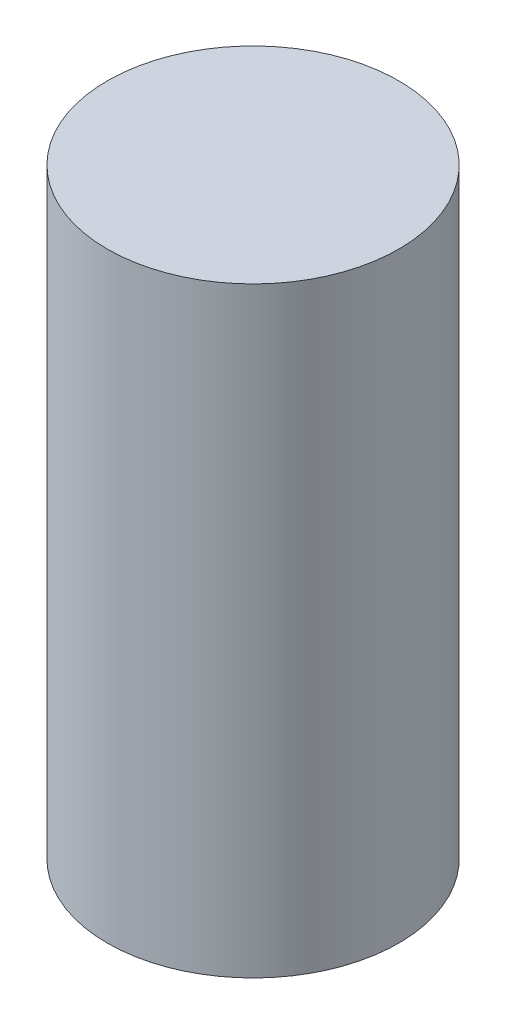
ISO-10303-21;
HEADER;
FILE_DESCRIPTION(('STEP AP214'),'2;1');
FILE_NAME('part.step','',(''),(''),'','','');
FILE_SCHEMA(('AUTOMOTIVE_DESIGN { 1 0 10303 214 1 1 1 1 }'));
ENDSEC;
DATA;
#1=APPLICATION_CONTEXT('core data for automotive mechanical design processes');
#2=APPLICATION_PROTOCOL_DEFINITION('international standard','automotive_design',2000,#1);
#3=PRODUCT_CONTEXT('',#1,'mechanical');
#4=PRODUCT('Part','Part','',(#3));
#5=PRODUCT_RELATED_PRODUCT_CATEGORY('part','',(#4));
#6=PRODUCT_DEFINITION_FORMATION('','',#4);
#7=PRODUCT_DEFINITION_CONTEXT('part definition',#1,'design');
#8=PRODUCT_DEFINITION('design','',#6,#7);
#9=PRODUCT_DEFINITION_SHAPE('','',#8);
#10=(LENGTH_UNIT() NAMED_UNIT(*) SI_UNIT(.MILLI.,.METRE.));
#11=(NAMED_UNIT(*) PLANE_ANGLE_UNIT() SI_UNIT($,.RADIAN.));
#12=(NAMED_UNIT(*) SI_UNIT($,.STERADIAN.) SOLID_ANGLE_UNIT());
#13=UNCERTAINTY_MEASURE_WITH_UNIT(LENGTH_MEASURE(1.E-05),#10,'distance_accuracy_value','');
#14=(GEOMETRIC_REPRESENTATION_CONTEXT(3) GLOBAL_UNCERTAINTY_ASSIGNED_CONTEXT((#13)) GLOBAL_UNIT_ASSIGNED_CONTEXT((#10,
#11,#12)) REPRESENTATION_CONTEXT('',''));
#15=CARTESIAN_POINT('',(0.,0.,0.));
#16=DIRECTION('',(0.,0.,1.));
#17=DIRECTION('',(1.,0.,0.));
#18=AXIS2_PLACEMENT_3D('',#15,#16,#17);
#19=CARTESIAN_POINT('',(0.,20.,0.));
#20=DIRECTION('',(0.,-1.,0.));
#21=DIRECTION('',(0.,0.,-1.));
#22=AXIS2_PLACEMENT_3D('',#19,#20,#21);
#23=CYLINDRICAL_SURFACE('',#22,4.85);
#24=CARTESIAN_POINT('',(0.,20.,0.));
#25=DIRECTION('',(0.,1.,0.));
#26=DIRECTION('',(0.,0.,1.));
#27=AXIS2_PLACEMENT_3D('',#24,#25,#26);
#28=CIRCLE('',#27,4.85);
#29=CARTESIAN_POINT('',(0.,20.,4.85));
#30=VERTEX_POINT('',#29);
#31=EDGE_CURVE('E10',#30,#30,#28,.T.);
#32=ORIENTED_EDGE('',*,*,#31,.F.);
#33=EDGE_LOOP('',(#32));
#34=FACE_BOUND('',#33,.T.);
#35=CARTESIAN_POINT('',(0.,0.,0.));
#36=DIRECTION('',(0.,1.,0.));
#37=DIRECTION('',(0.,0.,1.));
#38=AXIS2_PLACEMENT_3D('',#35,#36,#37);
#39=CIRCLE('',#38,4.85);
#40=CARTESIAN_POINT('',(0.,0.,4.85));
#41=VERTEX_POINT('',#40);
#42=EDGE_CURVE('E46',#41,#41,#39,.T.);
#43=ORIENTED_EDGE('',*,*,#42,.T.);
#44=EDGE_LOOP('',(#43));
#45=FACE_BOUND('',#44,.T.);
#46=ADVANCED_FACE('F43',(#34,#45),#23,.T.);
#47=CARTESIAN_POINT('',(0.,20.,0.));
#48=DIRECTION('',(0.,1.,0.));
#49=DIRECTION('',(0.,0.,1.));
#50=AXIS2_PLACEMENT_3D('',#47,#48,#49);
#51=PLANE('',#50);
#52=ORIENTED_EDGE('',*,*,#31,.T.);
#53=EDGE_LOOP('',(#52));
#54=FACE_BOUND('',#53,.T.);
#55=ADVANCED_FACE('F60',(#54),#51,.T.);
#56=CARTESIAN_POINT('',(0.,0.,0.));
#57=DIRECTION('',(0.,1.,0.));
#58=DIRECTION('',(0.,0.,1.));
#59=AXIS2_PLACEMENT_3D('',#56,#57,#58);
#60=PLANE('',#59);
#61=ORIENTED_EDGE('',*,*,#42,.F.);
#62=EDGE_LOOP('',(#61));
#63=FACE_BOUND('',#62,.T.);
#64=ADVANCED_FACE('F58',(#63),#60,.F.);
#65=CLOSED_SHELL('',(#46,#55,#64));
#66=MANIFOLD_SOLID_BREP('B2',#65);
#67=ADVANCED_BREP_SHAPE_REPRESENTATION('',(#18,#66),#14);
#68=SHAPE_DEFINITION_REPRESENTATION(#9,#67);
ENDSEC;
END-ISO-10303-21;
